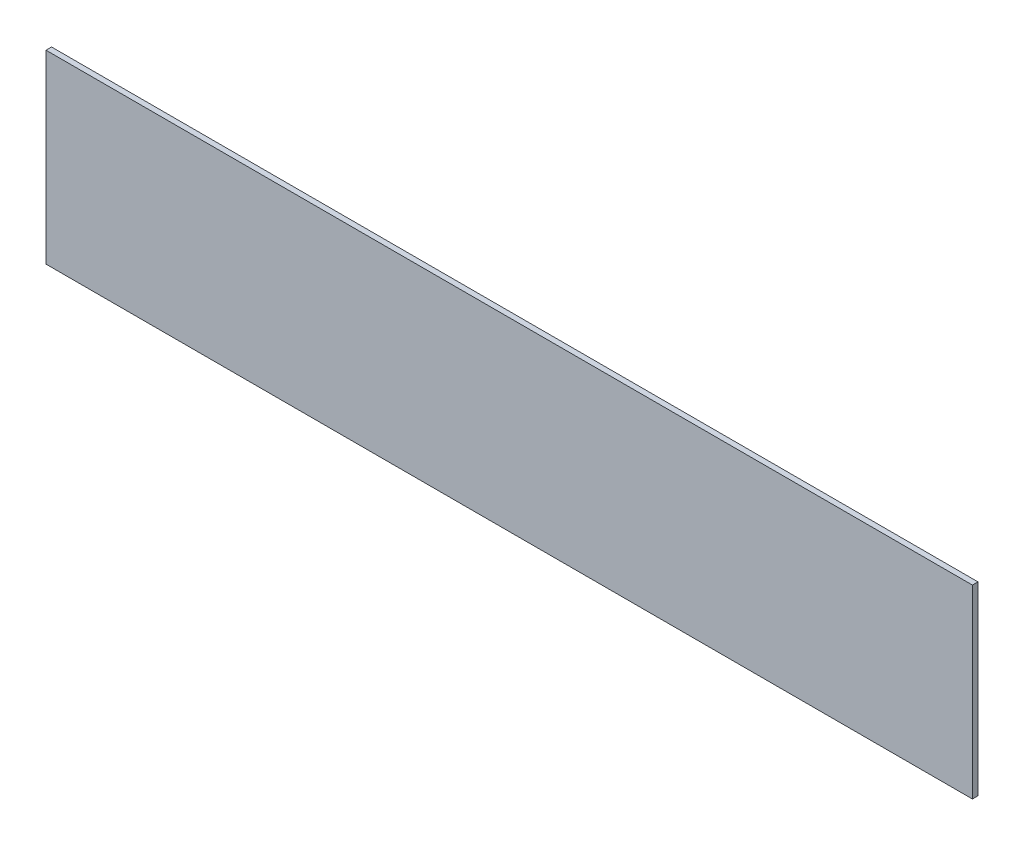
ISO-10303-21;
HEADER;
FILE_DESCRIPTION(('STEP AP214'),'2;1');
FILE_NAME('part.step','',(''),(''),'','','');
FILE_SCHEMA(('AUTOMOTIVE_DESIGN { 1 0 10303 214 1 1 1 1 }'));
ENDSEC;
DATA;
#1=APPLICATION_CONTEXT('core data for automotive mechanical design processes');
#2=APPLICATION_PROTOCOL_DEFINITION('international standard','automotive_design',2000,#1);
#3=PRODUCT_CONTEXT('',#1,'mechanical');
#4=PRODUCT('Part','Part','',(#3));
#5=PRODUCT_RELATED_PRODUCT_CATEGORY('part','',(#4));
#6=PRODUCT_DEFINITION_FORMATION('','',#4);
#7=PRODUCT_DEFINITION_CONTEXT('part definition',#1,'design');
#8=PRODUCT_DEFINITION('design','',#6,#7);
#9=PRODUCT_DEFINITION_SHAPE('','',#8);
#10=(LENGTH_UNIT() NAMED_UNIT(*) SI_UNIT(.MILLI.,.METRE.));
#11=(NAMED_UNIT(*) PLANE_ANGLE_UNIT() SI_UNIT($,.RADIAN.));
#12=(NAMED_UNIT(*) SI_UNIT($,.STERADIAN.) SOLID_ANGLE_UNIT());
#13=UNCERTAINTY_MEASURE_WITH_UNIT(LENGTH_MEASURE(1.E-05),#10,'distance_accuracy_value','');
#14=(GEOMETRIC_REPRESENTATION_CONTEXT(3) GLOBAL_UNCERTAINTY_ASSIGNED_CONTEXT((#13)) GLOBAL_UNIT_ASSIGNED_CONTEXT((#10,
#11,#12)) REPRESENTATION_CONTEXT('',''));
#15=CARTESIAN_POINT('',(0.,0.,0.));
#16=DIRECTION('',(0.,0.,1.));
#17=DIRECTION('',(1.,0.,0.));
#18=AXIS2_PLACEMENT_3D('',#15,#16,#17);
#19=CARTESIAN_POINT('',(0.,20.,0.6));
#20=DIRECTION('',(1.,0.,0.));
#21=DIRECTION('',(0.,1.,0.));
#22=AXIS2_PLACEMENT_3D('',#19,#20,#21);
#23=PLANE('',#22);
#24=DIRECTION('',(0.,-1.,0.));
#25=VECTOR('',#24,1.);
#26=CARTESIAN_POINT('',(0.,20.,0.));
#27=LINE('',#26,#25);
#28=CARTESIAN_POINT('',(0.,20.,0.));
#29=VERTEX_POINT('',#28);
#30=CARTESIAN_POINT('',(0.,0.,0.));
#31=VERTEX_POINT('',#30);
#32=EDGE_CURVE('E98',#29,#31,#27,.T.);
#33=ORIENTED_EDGE('',*,*,#32,.T.);
#34=DIRECTION('',(0.,0.,-1.));
#35=VECTOR('',#34,1.);
#36=CARTESIAN_POINT('',(0.,0.,0.6));
#37=LINE('',#36,#35);
#38=CARTESIAN_POINT('',(0.,0.,0.6));
#39=VERTEX_POINT('',#38);
#40=EDGE_CURVE('E11',#39,#31,#37,.T.);
#41=ORIENTED_EDGE('',*,*,#40,.F.);
#42=DIRECTION('',(0.,-1.,0.));
#43=VECTOR('',#42,1.);
#44=CARTESIAN_POINT('',(0.,20.,0.6));
#45=LINE('',#44,#43);
#46=CARTESIAN_POINT('',(0.,20.,0.6));
#47=VERTEX_POINT('',#46);
#48=EDGE_CURVE('E86',#47,#39,#45,.T.);
#49=ORIENTED_EDGE('',*,*,#48,.F.);
#50=DIRECTION('',(0.,0.,-1.));
#51=VECTOR('',#50,1.);
#52=CARTESIAN_POINT('',(0.,20.,0.6));
#53=LINE('',#52,#51);
#54=EDGE_CURVE('E94',#47,#29,#53,.T.);
#55=ORIENTED_EDGE('',*,*,#54,.T.);
#56=EDGE_LOOP('',(#33,#41,#49,#55));
#57=FACE_BOUND('',#56,.T.);
#58=ADVANCED_FACE('F35',(#57),#23,.F.);
#59=CARTESIAN_POINT('',(0.,0.,0.6));
#60=DIRECTION('',(0.,1.,0.));
#61=DIRECTION('',(0.,0.,1.));
#62=AXIS2_PLACEMENT_3D('',#59,#60,#61);
#63=PLANE('',#62);
#64=DIRECTION('',(1.,0.,0.));
#65=VECTOR('',#64,1.);
#66=CARTESIAN_POINT('',(0.,0.,0.));
#67=LINE('',#66,#65);
#68=CARTESIAN_POINT('',(100.,0.,0.));
#69=VERTEX_POINT('',#68);
#70=EDGE_CURVE('E90',#31,#69,#67,.T.);
#71=ORIENTED_EDGE('',*,*,#70,.T.);
#72=DIRECTION('',(0.,0.,-1.));
#73=VECTOR('',#72,1.);
#74=CARTESIAN_POINT('',(100.,0.,0.6));
#75=LINE('',#74,#73);
#76=CARTESIAN_POINT('',(100.,0.,0.6));
#77=VERTEX_POINT('',#76);
#78=EDGE_CURVE('E43',#77,#69,#75,.T.);
#79=ORIENTED_EDGE('',*,*,#78,.F.);
#80=DIRECTION('',(1.,0.,0.));
#81=VECTOR('',#80,1.);
#82=CARTESIAN_POINT('',(0.,0.,0.6));
#83=LINE('',#82,#81);
#84=EDGE_CURVE('E81',#39,#77,#83,.T.);
#85=ORIENTED_EDGE('',*,*,#84,.F.);
#86=ORIENTED_EDGE('',*,*,#40,.T.);
#87=EDGE_LOOP('',(#71,#79,#85,#86));
#88=FACE_BOUND('',#87,.T.);
#89=ADVANCED_FACE('F89',(#88),#63,.F.);
#90=CARTESIAN_POINT('',(100.,20.,0.6));
#91=DIRECTION('',(-1.,0.,0.));
#92=DIRECTION('',(0.,-1.,0.));
#93=AXIS2_PLACEMENT_3D('',#90,#91,#92);
#94=PLANE('',#93);
#95=DIRECTION('',(0.,1.,0.));
#96=VECTOR('',#95,1.);
#97=CARTESIAN_POINT('',(100.,20.,0.));
#98=LINE('',#97,#96);
#99=CARTESIAN_POINT('',(100.,20.,0.));
#100=VERTEX_POINT('',#99);
#101=EDGE_CURVE('E68',#69,#100,#98,.T.);
#102=ORIENTED_EDGE('',*,*,#101,.T.);
#103=DIRECTION('',(0.,0.,-1.));
#104=VECTOR('',#103,1.);
#105=CARTESIAN_POINT('',(100.,20.,0.6));
#106=LINE('',#105,#104);
#107=CARTESIAN_POINT('',(100.,20.,0.6));
#108=VERTEX_POINT('',#107);
#109=EDGE_CURVE('E91',#108,#100,#106,.T.);
#110=ORIENTED_EDGE('',*,*,#109,.F.);
#111=DIRECTION('',(0.,1.,0.));
#112=VECTOR('',#111,1.);
#113=CARTESIAN_POINT('',(100.,20.,0.6));
#114=LINE('',#113,#112);
#115=EDGE_CURVE('E84',#77,#108,#114,.T.);
#116=ORIENTED_EDGE('',*,*,#115,.F.);
#117=ORIENTED_EDGE('',*,*,#78,.T.);
#118=EDGE_LOOP('',(#102,#110,#116,#117));
#119=FACE_BOUND('',#118,.T.);
#120=ADVANCED_FACE('F92',(#119),#94,.F.);
#121=CARTESIAN_POINT('',(0.,20.,0.6));
#122=DIRECTION('',(0.,-1.,0.));
#123=DIRECTION('',(0.,0.,-1.));
#124=AXIS2_PLACEMENT_3D('',#121,#122,#123);
#125=PLANE('',#124);
#126=DIRECTION('',(-1.,0.,0.));
#127=VECTOR('',#126,1.);
#128=CARTESIAN_POINT('',(0.,20.,0.));
#129=LINE('',#128,#127);
#130=EDGE_CURVE('E74',#100,#29,#129,.T.);
#131=ORIENTED_EDGE('',*,*,#130,.T.);
#132=ORIENTED_EDGE('',*,*,#54,.F.);
#133=DIRECTION('',(-1.,0.,0.));
#134=VECTOR('',#133,1.);
#135=CARTESIAN_POINT('',(0.,20.,0.6));
#136=LINE('',#135,#134);
#137=EDGE_CURVE('E51',#108,#47,#136,.T.);
#138=ORIENTED_EDGE('',*,*,#137,.F.);
#139=ORIENTED_EDGE('',*,*,#109,.T.);
#140=EDGE_LOOP('',(#131,#132,#138,#139));
#141=FACE_BOUND('',#140,.T.);
#142=ADVANCED_FACE('F105',(#141),#125,.F.);
#143=CARTESIAN_POINT('',(0.,0.,0.6));
#144=DIRECTION('',(0.,0.,1.));
#145=DIRECTION('',(1.,0.,0.));
#146=AXIS2_PLACEMENT_3D('',#143,#144,#145);
#147=PLANE('',#146);
#148=ORIENTED_EDGE('',*,*,#48,.T.);
#149=ORIENTED_EDGE('',*,*,#84,.T.);
#150=ORIENTED_EDGE('',*,*,#115,.T.);
#151=ORIENTED_EDGE('',*,*,#137,.T.);
#152=EDGE_LOOP('',(#148,#149,#150,#151));
#153=FACE_BOUND('',#152,.T.);
#154=ADVANCED_FACE('F82',(#153),#147,.T.);
#155=CARTESIAN_POINT('',(0.,0.,0.));
#156=DIRECTION('',(0.,0.,1.));
#157=DIRECTION('',(1.,0.,0.));
#158=AXIS2_PLACEMENT_3D('',#155,#156,#157);
#159=PLANE('',#158);
#160=ORIENTED_EDGE('',*,*,#32,.F.);
#161=ORIENTED_EDGE('',*,*,#130,.F.);
#162=ORIENTED_EDGE('',*,*,#101,.F.);
#163=ORIENTED_EDGE('',*,*,#70,.F.);
#164=EDGE_LOOP('',(#160,#161,#162,#163));
#165=FACE_BOUND('',#164,.T.);
#166=ADVANCED_FACE('F108',(#165),#159,.F.);
#167=CLOSED_SHELL('',(#58,#89,#120,#142,#154,#166));
#168=MANIFOLD_SOLID_BREP('B2',#167);
#169=ADVANCED_BREP_SHAPE_REPRESENTATION('',(#18,#168),#14);
#170=SHAPE_DEFINITION_REPRESENTATION(#9,#169);
ENDSEC;
END-ISO-10303-21;
